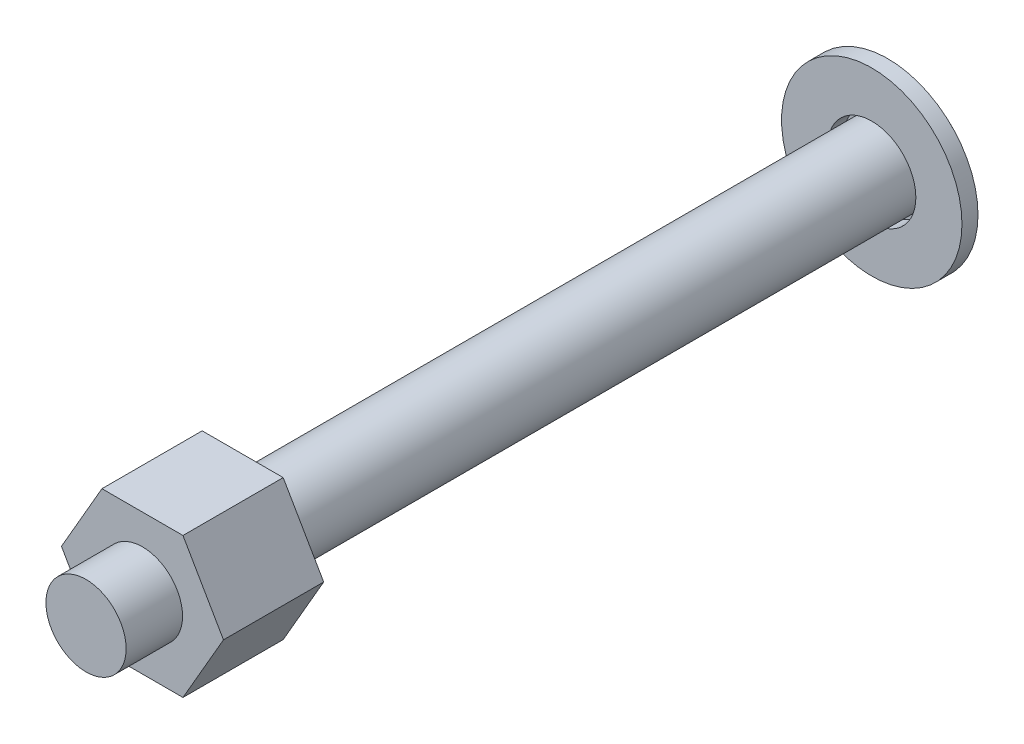
ISO-10303-21;
HEADER;
FILE_DESCRIPTION(('STEP AP214'),'2;1');
FILE_NAME('part.step','',(''),(''),'','','');
FILE_SCHEMA(('AUTOMOTIVE_DESIGN { 1 0 10303 214 1 1 1 1 }'));
ENDSEC;
DATA;
#1=APPLICATION_CONTEXT('core data for automotive mechanical design processes');
#2=APPLICATION_PROTOCOL_DEFINITION('international standard','automotive_design',2000,#1);
#3=PRODUCT_CONTEXT('',#1,'mechanical');
#4=PRODUCT('Part','Part','',(#3));
#5=PRODUCT_RELATED_PRODUCT_CATEGORY('part','',(#4));
#6=PRODUCT_DEFINITION_FORMATION('','',#4);
#7=PRODUCT_DEFINITION_CONTEXT('part definition',#1,'design');
#8=PRODUCT_DEFINITION('design','',#6,#7);
#9=PRODUCT_DEFINITION_SHAPE('','',#8);
#10=(LENGTH_UNIT() NAMED_UNIT(*) SI_UNIT(.MILLI.,.METRE.));
#11=(NAMED_UNIT(*) PLANE_ANGLE_UNIT() SI_UNIT($,.RADIAN.));
#12=(NAMED_UNIT(*) SI_UNIT($,.STERADIAN.) SOLID_ANGLE_UNIT());
#13=UNCERTAINTY_MEASURE_WITH_UNIT(LENGTH_MEASURE(1.E-05),#10,'distance_accuracy_value','');
#14=(GEOMETRIC_REPRESENTATION_CONTEXT(3) GLOBAL_UNCERTAINTY_ASSIGNED_CONTEXT((#13)) GLOBAL_UNIT_ASSIGNED_CONTEXT((#10,
#11,#12)) REPRESENTATION_CONTEXT('',''));
#15=CARTESIAN_POINT('',(0.,0.,0.));
#16=DIRECTION('',(0.,0.,1.));
#17=DIRECTION('',(1.,0.,0.));
#18=AXIS2_PLACEMENT_3D('',#15,#16,#17);
#19=CARTESIAN_POINT('',(51.2,59.9,66.2));
#20=DIRECTION('',(0.,0.,1.));
#21=DIRECTION('',(1.,0.,0.));
#22=AXIS2_PLACEMENT_3D('',#19,#20,#21);
#23=PLANE('',#22);
#24=CARTESIAN_POINT('',(51.2,59.9,66.2));
#25=DIRECTION('',(0.,0.,1.));
#26=DIRECTION('',(1.,0.,0.));
#27=AXIS2_PLACEMENT_3D('',#24,#25,#26);
#28=CIRCLE('',#27,2.);
#29=CARTESIAN_POINT('',(53.2,59.9,66.2));
#30=VERTEX_POINT('',#29);
#31=EDGE_CURVE('E9',#30,#30,#28,.T.);
#32=ORIENTED_EDGE('',*,*,#31,.T.);
#33=EDGE_LOOP('',(#32));
#34=FACE_BOUND('',#33,.T.);
#35=ADVANCED_FACE('F14',(#34),#23,.T.);
#36=CARTESIAN_POINT('',(51.2,59.9,26.2));
#37=DIRECTION('',(0.,0.,1.));
#38=DIRECTION('',(1.,0.,0.));
#39=AXIS2_PLACEMENT_3D('',#36,#37,#38);
#40=CYLINDRICAL_SURFACE('',#39,2.);
#41=DIRECTION('',(0.,0.,1.));
#42=VECTOR('',#41,1.);
#43=CARTESIAN_POINT('',(53.2,59.9,26.2));
#44=LINE('',#43,#42);
#45=CARTESIAN_POINT('',(53.2,59.9,63.384118852459));
#46=VERTEX_POINT('',#45);
#47=EDGE_CURVE('E25',#46,#30,#44,.T.);
#48=ORIENTED_EDGE('',*,*,#47,.T.);
#49=ORIENTED_EDGE('',*,*,#31,.F.);
#50=ORIENTED_EDGE('',*,*,#47,.F.);
#51=CARTESIAN_POINT('',(51.2,59.9,63.384118852459));
#52=DIRECTION('',(0.,0.,1.));
#53=DIRECTION('',(1.,0.,0.));
#54=AXIS2_PLACEMENT_3D('',#51,#52,#53);
#55=CIRCLE('',#54,2.);
#56=EDGE_CURVE('E18',#46,#46,#55,.T.);
#57=ORIENTED_EDGE('',*,*,#56,.T.);
#58=EDGE_LOOP('',(#48,#49,#50,#57));
#59=FACE_BOUND('',#58,.T.);
#60=ADVANCED_FACE('F260',(#59),#40,.T.);
#61=CARTESIAN_POINT('',(51.2,59.9,63.384118852459));
#62=DIRECTION('',(0.,0.,1.));
#63=DIRECTION('',(1.,0.,0.));
#64=AXIS2_PLACEMENT_3D('',#61,#62,#63);
#65=PLANE('',#64);
#66=ORIENTED_EDGE('',*,*,#56,.F.);
#67=EDGE_LOOP('',(#66));
#68=FACE_BOUND('',#67,.T.);
#69=DIRECTION('',(-0.50000000000019,0.866025403784329,0.));
#70=VECTOR('',#69,1.);
#71=CARTESIAN_POINT('',(55.241451884327,59.9,63.384118852459));
#72=LINE('',#71,#70);
#73=CARTESIAN_POINT('',(55.241451884327,59.9,63.384118852459));
#74=VERTEX_POINT('',#73);
#75=CARTESIAN_POINT('',(53.220725942164,63.4,63.384118852459));
#76=VERTEX_POINT('',#75);
#77=EDGE_CURVE('E205',#74,#76,#72,.T.);
#78=ORIENTED_EDGE('',*,*,#77,.T.);
#79=DIRECTION('',(-1.,0.,0.));
#80=VECTOR('',#79,1.);
#81=CARTESIAN_POINT('',(53.220725942164,63.4,63.384118852459));
#82=LINE('',#81,#80);
#83=CARTESIAN_POINT('',(49.179274057836,63.4,63.384118852459));
#84=VERTEX_POINT('',#83);
#85=EDGE_CURVE('E130',#76,#84,#82,.T.);
#86=ORIENTED_EDGE('',*,*,#85,.T.);
#87=DIRECTION('',(-0.50000000000019,-0.866025403784329,0.));
#88=VECTOR('',#87,1.);
#89=CARTESIAN_POINT('',(49.179274057836,63.4,63.384118852459));
#90=LINE('',#89,#88);
#91=CARTESIAN_POINT('',(47.158548115673,59.9,63.384118852459));
#92=VERTEX_POINT('',#91);
#93=EDGE_CURVE('E126',#84,#92,#90,.T.);
#94=ORIENTED_EDGE('',*,*,#93,.T.);
#95=DIRECTION('',(0.50000000000019,-0.866025403784329,0.));
#96=VECTOR('',#95,1.);
#97=CARTESIAN_POINT('',(47.158548115673,59.9,63.384118852459));
#98=LINE('',#97,#96);
#99=CARTESIAN_POINT('',(49.179274057836,56.4,63.384118852459));
#100=VERTEX_POINT('',#99);
#101=EDGE_CURVE('E316',#92,#100,#98,.T.);
#102=ORIENTED_EDGE('',*,*,#101,.T.);
#103=DIRECTION('',(1.,0.,0.));
#104=VECTOR('',#103,1.);
#105=CARTESIAN_POINT('',(49.179274057836,56.4,63.384118852459));
#106=LINE('',#105,#104);
#107=CARTESIAN_POINT('',(53.220725942164,56.4,63.384118852459));
#108=VERTEX_POINT('',#107);
#109=EDGE_CURVE('E172',#100,#108,#106,.T.);
#110=ORIENTED_EDGE('',*,*,#109,.T.);
#111=DIRECTION('',(0.50000000000019,0.866025403784329,0.));
#112=VECTOR('',#111,1.);
#113=CARTESIAN_POINT('',(53.220725942164,56.4,63.384118852459));
#114=LINE('',#113,#112);
#115=EDGE_CURVE('E171',#108,#74,#114,.T.);
#116=ORIENTED_EDGE('',*,*,#115,.T.);
#117=EDGE_LOOP('',(#78,#86,#94,#102,#110,#116));
#118=FACE_BOUND('',#117,.T.);
#119=ADVANCED_FACE('F265',(#68,#118),#65,.T.);
#120=CARTESIAN_POINT('',(47.158548115673,59.9,58.384118852459));
#121=DIRECTION('',(0.866025403784329,0.50000000000019,0.));
#122=DIRECTION('',(0.,0.,-1.));
#123=AXIS2_PLACEMENT_3D('',#120,#121,#122);
#124=PLANE('',#123);
#125=DIRECTION('',(0.50000000000019,-0.866025403784329,0.));
#126=VECTOR('',#125,1.);
#127=CARTESIAN_POINT('',(47.158548115673,59.9,58.384118852459));
#128=LINE('',#127,#126);
#129=CARTESIAN_POINT('',(47.158548115673,59.9,58.384118852459));
#130=VERTEX_POINT('',#129);
#131=CARTESIAN_POINT('',(49.179274057836,56.4,58.384118852459));
#132=VERTEX_POINT('',#131);
#133=EDGE_CURVE('E148',#130,#132,#128,.T.);
#134=ORIENTED_EDGE('',*,*,#133,.T.);
#135=DIRECTION('',(0.,0.,1.));
#136=VECTOR('',#135,1.);
#137=CARTESIAN_POINT('',(49.179274057836,56.4,58.384118852459));
#138=LINE('',#137,#136);
#139=EDGE_CURVE('E174',#132,#100,#138,.T.);
#140=ORIENTED_EDGE('',*,*,#139,.T.);
#141=ORIENTED_EDGE('',*,*,#101,.F.);
#142=DIRECTION('',(0.,0.,1.));
#143=VECTOR('',#142,1.);
#144=CARTESIAN_POINT('',(47.158548115673,59.9,58.384118852459));
#145=LINE('',#144,#143);
#146=EDGE_CURVE('E190',#130,#92,#145,.T.);
#147=ORIENTED_EDGE('',*,*,#146,.F.);
#148=EDGE_LOOP('',(#134,#140,#141,#147));
#149=FACE_BOUND('',#148,.T.);
#150=ADVANCED_FACE('F284',(#149),#124,.F.);
#151=CARTESIAN_POINT('',(49.179274057836,63.4,58.384118852459));
#152=DIRECTION('',(0.866025403784329,-0.50000000000019,0.));
#153=DIRECTION('',(0.,0.,-1.));
#154=AXIS2_PLACEMENT_3D('',#151,#152,#153);
#155=PLANE('',#154);
#156=DIRECTION('',(-0.50000000000019,-0.866025403784329,0.));
#157=VECTOR('',#156,1.);
#158=CARTESIAN_POINT('',(49.179274057836,63.4,58.384118852459));
#159=LINE('',#158,#157);
#160=CARTESIAN_POINT('',(49.179274057836,63.4,58.384118852459));
#161=VERTEX_POINT('',#160);
#162=EDGE_CURVE('E123',#161,#130,#159,.T.);
#163=ORIENTED_EDGE('',*,*,#162,.T.);
#164=ORIENTED_EDGE('',*,*,#146,.T.);
#165=ORIENTED_EDGE('',*,*,#93,.F.);
#166=DIRECTION('',(0.,0.,1.));
#167=VECTOR('',#166,1.);
#168=CARTESIAN_POINT('',(49.179274057836,63.4,58.384118852459));
#169=LINE('',#168,#167);
#170=EDGE_CURVE('E118',#161,#84,#169,.T.);
#171=ORIENTED_EDGE('',*,*,#170,.F.);
#172=EDGE_LOOP('',(#163,#164,#165,#171));
#173=FACE_BOUND('',#172,.T.);
#174=ADVANCED_FACE('F120',(#173),#155,.F.);
#175=CARTESIAN_POINT('',(49.179274057836,56.4,58.384118852459));
#176=DIRECTION('',(0.,1.,0.));
#177=DIRECTION('',(1.,0.,0.));
#178=AXIS2_PLACEMENT_3D('',#175,#176,#177);
#179=PLANE('',#178);
#180=DIRECTION('',(1.,0.,0.));
#181=VECTOR('',#180,1.);
#182=CARTESIAN_POINT('',(49.179274057836,56.4,58.384118852459));
#183=LINE('',#182,#181);
#184=CARTESIAN_POINT('',(53.220725942164,56.4,58.384118852459));
#185=VERTEX_POINT('',#184);
#186=EDGE_CURVE('E155',#132,#185,#183,.T.);
#187=ORIENTED_EDGE('',*,*,#186,.T.);
#188=DIRECTION('',(0.,0.,1.));
#189=VECTOR('',#188,1.);
#190=CARTESIAN_POINT('',(53.220725942164,56.4,58.384118852459));
#191=LINE('',#190,#189);
#192=EDGE_CURVE('E131',#185,#108,#191,.T.);
#193=ORIENTED_EDGE('',*,*,#192,.T.);
#194=ORIENTED_EDGE('',*,*,#109,.F.);
#195=ORIENTED_EDGE('',*,*,#139,.F.);
#196=EDGE_LOOP('',(#187,#193,#194,#195));
#197=FACE_BOUND('',#196,.T.);
#198=ADVANCED_FACE('F273',(#197),#179,.F.);
#199=CARTESIAN_POINT('',(53.220725942164,63.4,58.384118852459));
#200=DIRECTION('',(0.,-1.,0.));
#201=DIRECTION('',(-1.,0.,0.));
#202=AXIS2_PLACEMENT_3D('',#199,#200,#201);
#203=PLANE('',#202);
#204=DIRECTION('',(-1.,0.,0.));
#205=VECTOR('',#204,1.);
#206=CARTESIAN_POINT('',(53.220725942164,63.4,58.384118852459));
#207=LINE('',#206,#205);
#208=CARTESIAN_POINT('',(53.220725942164,63.4,58.384118852459));
#209=VERTEX_POINT('',#208);
#210=EDGE_CURVE('E134',#209,#161,#207,.T.);
#211=ORIENTED_EDGE('',*,*,#210,.T.);
#212=ORIENTED_EDGE('',*,*,#170,.T.);
#213=ORIENTED_EDGE('',*,*,#85,.F.);
#214=DIRECTION('',(0.,0.,1.));
#215=VECTOR('',#214,1.);
#216=CARTESIAN_POINT('',(53.220725942164,63.4,58.384118852459));
#217=LINE('',#216,#215);
#218=EDGE_CURVE('E137',#209,#76,#217,.T.);
#219=ORIENTED_EDGE('',*,*,#218,.F.);
#220=EDGE_LOOP('',(#211,#212,#213,#219));
#221=FACE_BOUND('',#220,.T.);
#222=ADVANCED_FACE('F135',(#221),#203,.F.);
#223=CARTESIAN_POINT('',(53.220725942164,56.4,58.384118852459));
#224=DIRECTION('',(-0.866025403784329,0.50000000000019,0.));
#225=DIRECTION('',(0.,0.,1.));
#226=AXIS2_PLACEMENT_3D('',#223,#224,#225);
#227=PLANE('',#226);
#228=DIRECTION('',(0.50000000000019,0.866025403784329,0.));
#229=VECTOR('',#228,1.);
#230=CARTESIAN_POINT('',(53.220725942164,56.4,58.384118852459));
#231=LINE('',#230,#229);
#232=CARTESIAN_POINT('',(55.241451884327,59.9,58.384118852459));
#233=VERTEX_POINT('',#232);
#234=EDGE_CURVE('E186',#185,#233,#231,.T.);
#235=ORIENTED_EDGE('',*,*,#234,.T.);
#236=DIRECTION('',(0.,0.,1.));
#237=VECTOR('',#236,1.);
#238=CARTESIAN_POINT('',(55.241451884327,59.9,58.384118852459));
#239=LINE('',#238,#237);
#240=EDGE_CURVE('E195',#233,#74,#239,.T.);
#241=ORIENTED_EDGE('',*,*,#240,.T.);
#242=ORIENTED_EDGE('',*,*,#115,.F.);
#243=ORIENTED_EDGE('',*,*,#192,.F.);
#244=EDGE_LOOP('',(#235,#241,#242,#243));
#245=FACE_BOUND('',#244,.T.);
#246=ADVANCED_FACE('F272',(#245),#227,.F.);
#247=CARTESIAN_POINT('',(55.241451884327,59.9,58.384118852459));
#248=DIRECTION('',(-0.866025403784329,-0.50000000000019,0.));
#249=DIRECTION('',(-0.50000000000019,0.866025403784329,0.));
#250=AXIS2_PLACEMENT_3D('',#247,#248,#249);
#251=PLANE('',#250);
#252=DIRECTION('',(-0.50000000000019,0.866025403784329,0.));
#253=VECTOR('',#252,1.);
#254=CARTESIAN_POINT('',(55.241451884327,59.9,58.384118852459));
#255=LINE('',#254,#253);
#256=EDGE_CURVE('E142',#233,#209,#255,.T.);
#257=ORIENTED_EDGE('',*,*,#256,.T.);
#258=ORIENTED_EDGE('',*,*,#218,.T.);
#259=ORIENTED_EDGE('',*,*,#77,.F.);
#260=ORIENTED_EDGE('',*,*,#240,.F.);
#261=EDGE_LOOP('',(#257,#258,#259,#260));
#262=FACE_BOUND('',#261,.T.);
#263=ADVANCED_FACE('F281',(#262),#251,.F.);
#264=CARTESIAN_POINT('',(51.2,59.9,58.384118852459));
#265=DIRECTION('',(0.,0.,1.));
#266=DIRECTION('',(1.,0.,0.));
#267=AXIS2_PLACEMENT_3D('',#264,#265,#266);
#268=PLANE('',#267);
#269=CARTESIAN_POINT('',(51.2,59.9,58.384118852459));
#270=DIRECTION('',(0.,0.,1.));
#271=DIRECTION('',(1.,0.,0.));
#272=AXIS2_PLACEMENT_3D('',#269,#270,#271);
#273=CIRCLE('',#272,2.);
#274=CARTESIAN_POINT('',(53.2,59.9,58.384118852459));
#275=VERTEX_POINT('',#274);
#276=EDGE_CURVE('E176',#275,#275,#273,.T.);
#277=ORIENTED_EDGE('',*,*,#276,.T.);
#278=EDGE_LOOP('',(#277));
#279=FACE_BOUND('',#278,.T.);
#280=ORIENTED_EDGE('',*,*,#234,.F.);
#281=ORIENTED_EDGE('',*,*,#186,.F.);
#282=ORIENTED_EDGE('',*,*,#133,.F.);
#283=ORIENTED_EDGE('',*,*,#162,.F.);
#284=ORIENTED_EDGE('',*,*,#210,.F.);
#285=ORIENTED_EDGE('',*,*,#256,.F.);
#286=EDGE_LOOP('',(#280,#281,#282,#283,#284,#285));
#287=FACE_BOUND('',#286,.T.);
#288=ADVANCED_FACE('F145',(#279,#287),#268,.F.);
#289=CARTESIAN_POINT('',(51.2,59.9,26.2));
#290=DIRECTION('',(0.,0.,1.));
#291=DIRECTION('',(1.,0.,0.));
#292=AXIS2_PLACEMENT_3D('',#289,#290,#291);
#293=CYLINDRICAL_SURFACE('',#292,2.);
#294=ORIENTED_EDGE('',*,*,#276,.F.);
#295=DIRECTION('',(0.,0.,1.));
#296=VECTOR('',#295,1.);
#297=CARTESIAN_POINT('',(53.2,59.9,26.2));
#298=LINE('',#297,#296);
#299=CARTESIAN_POINT('',(53.2,59.9,26.2));
#300=VERTEX_POINT('',#299);
#301=EDGE_CURVE('E180',#300,#275,#298,.T.);
#302=ORIENTED_EDGE('',*,*,#301,.F.);
#303=CARTESIAN_POINT('',(51.2,59.9,26.2));
#304=DIRECTION('',(0.,0.,1.));
#305=DIRECTION('',(1.,0.,0.));
#306=AXIS2_PLACEMENT_3D('',#303,#304,#305);
#307=CIRCLE('',#306,2.);
#308=EDGE_CURVE('E181',#300,#300,#307,.T.);
#309=ORIENTED_EDGE('',*,*,#308,.T.);
#310=ORIENTED_EDGE('',*,*,#301,.T.);
#311=EDGE_LOOP('',(#294,#302,#309,#310));
#312=FACE_BOUND('',#311,.T.);
#313=ADVANCED_FACE('F16',(#312),#293,.T.);
#314=CARTESIAN_POINT('',(51.2,59.9,26.2));
#315=DIRECTION('',(0.,0.,1.));
#316=DIRECTION('',(1.,0.,0.));
#317=AXIS2_PLACEMENT_3D('',#314,#315,#316);
#318=PLANE('',#317);
#319=ORIENTED_EDGE('',*,*,#308,.F.);
#320=EDGE_LOOP('',(#319));
#321=FACE_BOUND('',#320,.T.);
#322=CARTESIAN_POINT('',(51.2,59.9,26.2));
#323=DIRECTION('',(0.,0.,1.));
#324=DIRECTION('',(1.,0.,0.));
#325=AXIS2_PLACEMENT_3D('',#322,#323,#324);
#326=CIRCLE('',#325,2.2);
#327=CARTESIAN_POINT('',(53.4,59.9,26.2));
#328=VERTEX_POINT('',#327);
#329=EDGE_CURVE('E185',#328,#328,#326,.T.);
#330=ORIENTED_EDGE('',*,*,#329,.T.);
#331=EDGE_LOOP('',(#330));
#332=FACE_BOUND('',#331,.T.);
#333=ADVANCED_FACE('F226',(#321,#332),#318,.T.);
#334=CARTESIAN_POINT('',(51.2,59.9,25.7));
#335=DIRECTION('',(0.,0.,1.));
#336=DIRECTION('',(1.,0.,0.));
#337=AXIS2_PLACEMENT_3D('',#334,#335,#336);
#338=CYLINDRICAL_SURFACE('',#337,2.2);
#339=DIRECTION('',(0.,0.,1.));
#340=VECTOR('',#339,1.);
#341=CARTESIAN_POINT('',(53.4,59.9,25.7));
#342=LINE('',#341,#340);
#343=CARTESIAN_POINT('',(53.4,59.9,27.));
#344=VERTEX_POINT('',#343);
#345=EDGE_CURVE('E182',#328,#344,#342,.T.);
#346=ORIENTED_EDGE('',*,*,#345,.F.);
#347=ORIENTED_EDGE('',*,*,#329,.F.);
#348=ORIENTED_EDGE('',*,*,#345,.T.);
#349=CARTESIAN_POINT('',(51.2,59.9,27.));
#350=DIRECTION('',(0.,0.,1.));
#351=DIRECTION('',(1.,0.,0.));
#352=AXIS2_PLACEMENT_3D('',#349,#350,#351);
#353=CIRCLE('',#352,2.2);
#354=EDGE_CURVE('E166',#344,#344,#353,.T.);
#355=ORIENTED_EDGE('',*,*,#354,.T.);
#356=EDGE_LOOP('',(#346,#347,#348,#355));
#357=FACE_BOUND('',#356,.T.);
#358=ADVANCED_FACE('F229',(#357),#338,.F.);
#359=CARTESIAN_POINT('',(51.2,59.9,27.));
#360=DIRECTION('',(0.,0.,1.));
#361=DIRECTION('',(1.,0.,0.));
#362=AXIS2_PLACEMENT_3D('',#359,#360,#361);
#363=PLANE('',#362);
#364=ORIENTED_EDGE('',*,*,#354,.F.);
#365=EDGE_LOOP('',(#364));
#366=FACE_BOUND('',#365,.T.);
#367=CARTESIAN_POINT('',(51.2,59.9,27.));
#368=DIRECTION('',(0.,0.,1.));
#369=DIRECTION('',(1.,0.,0.));
#370=AXIS2_PLACEMENT_3D('',#367,#368,#369);
#371=CIRCLE('',#370,4.5);
#372=CARTESIAN_POINT('',(55.7,59.9,27.));
#373=VERTEX_POINT('',#372);
#374=EDGE_CURVE('E167',#373,#373,#371,.T.);
#375=ORIENTED_EDGE('',*,*,#374,.T.);
#376=EDGE_LOOP('',(#375));
#377=FACE_BOUND('',#376,.T.);
#378=ADVANCED_FACE('F236',(#366,#377),#363,.T.);
#379=CARTESIAN_POINT('',(51.2,59.9,26.2));
#380=DIRECTION('',(0.,0.,1.));
#381=DIRECTION('',(1.,0.,0.));
#382=AXIS2_PLACEMENT_3D('',#379,#380,#381);
#383=CYLINDRICAL_SURFACE('',#382,4.5);
#384=ORIENTED_EDGE('',*,*,#374,.F.);
#385=DIRECTION('',(0.,0.,1.));
#386=VECTOR('',#385,1.);
#387=CARTESIAN_POINT('',(55.7,59.9,26.2));
#388=LINE('',#387,#386);
#389=CARTESIAN_POINT('',(55.7,59.9,26.2));
#390=VERTEX_POINT('',#389);
#391=EDGE_CURVE('E163',#390,#373,#388,.T.);
#392=ORIENTED_EDGE('',*,*,#391,.F.);
#393=CARTESIAN_POINT('',(51.2,59.9,26.2));
#394=DIRECTION('',(0.,0.,1.));
#395=DIRECTION('',(1.,0.,0.));
#396=AXIS2_PLACEMENT_3D('',#393,#394,#395);
#397=CIRCLE('',#396,4.5);
#398=EDGE_CURVE('E161',#390,#390,#397,.T.);
#399=ORIENTED_EDGE('',*,*,#398,.T.);
#400=ORIENTED_EDGE('',*,*,#391,.T.);
#401=EDGE_LOOP('',(#384,#392,#399,#400));
#402=FACE_BOUND('',#401,.T.);
#403=ADVANCED_FACE('F239',(#402),#383,.T.);
#404=CARTESIAN_POINT('',(51.2,59.9,26.2));
#405=DIRECTION('',(0.,0.,1.));
#406=DIRECTION('',(1.,0.,0.));
#407=AXIS2_PLACEMENT_3D('',#404,#405,#406);
#408=PLANE('',#407);
#409=CARTESIAN_POINT('',(51.2,59.9,26.2));
#410=DIRECTION('',(0.,0.,1.));
#411=DIRECTION('',(1.,0.,0.));
#412=AXIS2_PLACEMENT_3D('',#409,#410,#411);
#413=CIRCLE('',#412,3.8);
#414=CARTESIAN_POINT('',(55.,59.9,26.2));
#415=VERTEX_POINT('',#414);
#416=EDGE_CURVE('E162',#415,#415,#413,.T.);
#417=ORIENTED_EDGE('',*,*,#416,.T.);
#418=EDGE_LOOP('',(#417));
#419=FACE_BOUND('',#418,.T.);
#420=ORIENTED_EDGE('',*,*,#398,.F.);
#421=EDGE_LOOP('',(#420));
#422=FACE_BOUND('',#421,.T.);
#423=ADVANCED_FACE('F245',(#419,#422),#408,.F.);
#424=CARTESIAN_POINT('',(51.2,59.9,28.381818181818));
#425=DIRECTION('',(0.,0.,1.));
#426=DIRECTION('',(1.,0.,0.));
#427=AXIS2_PLACEMENT_3D('',#424,#425,#426);
#428=SPHERICAL_SURFACE('',#427,4.381818181818);
#429=ORIENTED_EDGE('',*,*,#416,.F.);
#430=CARTESIAN_POINT('',(51.2,59.9,28.381818181818));
#431=DIRECTION('',(0.,-1.,0.));
#432=DIRECTION('',(1.,0.,0.));
#433=AXIS2_PLACEMENT_3D('',#430,#431,#432);
#434=CIRCLE('',#433,4.381818181818);
#435=CARTESIAN_POINT('',(51.2,59.9,24.));
#436=VERTEX_POINT('',#435);
#437=EDGE_CURVE('E159',#436,#415,#434,.T.);
#438=ORIENTED_EDGE('',*,*,#437,.F.);
#439=ORIENTED_EDGE('',*,*,#437,.T.);
#440=EDGE_LOOP('',(#429,#438,#439));
#441=FACE_BOUND('',#440,.T.);
#442=ADVANCED_FACE('F247',(#441),#428,.T.);
#443=CLOSED_SHELL('',(#35,#60,#119,#150,#174,#198,#222,#246,#263,#288,#313,#333,#358,#378,#403,
#423,#442));
#444=MANIFOLD_SOLID_BREP('B1',#443);
#445=ADVANCED_BREP_SHAPE_REPRESENTATION('',(#18,#444),#14);
#446=SHAPE_DEFINITION_REPRESENTATION(#9,#445);
ENDSEC;
END-ISO-10303-21;
